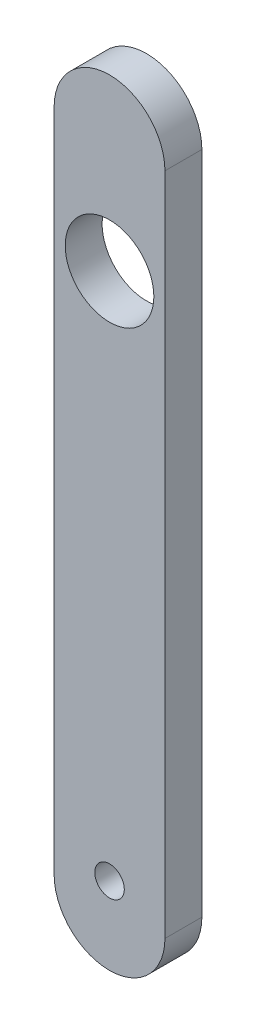
ISO-10303-21;
HEADER;
FILE_DESCRIPTION(('STEP AP214'),'2;1');
FILE_NAME('part.step','',(''),(''),'','','');
FILE_SCHEMA(('AUTOMOTIVE_DESIGN { 1 0 10303 214 1 1 1 1 }'));
ENDSEC;
DATA;
#1=APPLICATION_CONTEXT('core data for automotive mechanical design processes');
#2=APPLICATION_PROTOCOL_DEFINITION('international standard','automotive_design',2000,#1);
#3=PRODUCT_CONTEXT('',#1,'mechanical');
#4=PRODUCT('Part','Part','',(#3));
#5=PRODUCT_RELATED_PRODUCT_CATEGORY('part','',(#4));
#6=PRODUCT_DEFINITION_FORMATION('','',#4);
#7=PRODUCT_DEFINITION_CONTEXT('part definition',#1,'design');
#8=PRODUCT_DEFINITION('design','',#6,#7);
#9=PRODUCT_DEFINITION_SHAPE('','',#8);
#10=(LENGTH_UNIT() NAMED_UNIT(*) SI_UNIT(.MILLI.,.METRE.));
#11=(NAMED_UNIT(*) PLANE_ANGLE_UNIT() SI_UNIT($,.RADIAN.));
#12=(NAMED_UNIT(*) SI_UNIT($,.STERADIAN.) SOLID_ANGLE_UNIT());
#13=UNCERTAINTY_MEASURE_WITH_UNIT(LENGTH_MEASURE(1.E-05),#10,'distance_accuracy_value','');
#14=(GEOMETRIC_REPRESENTATION_CONTEXT(3) GLOBAL_UNCERTAINTY_ASSIGNED_CONTEXT((#13)) GLOBAL_UNIT_ASSIGNED_CONTEXT((#10,
#11,#12)) REPRESENTATION_CONTEXT('',''));
#15=CARTESIAN_POINT('',(0.,0.,0.));
#16=DIRECTION('',(0.,0.,1.));
#17=DIRECTION('',(1.,0.,0.));
#18=AXIS2_PLACEMENT_3D('',#15,#16,#17);
#19=CARTESIAN_POINT('',(7.5,0.,5.));
#20=DIRECTION('',(0.,0.,1.));
#21=DIRECTION('',(1.,0.,0.));
#22=AXIS2_PLACEMENT_3D('',#19,#20,#21);
#23=PLANE('',#22);
#24=CARTESIAN_POINT('',(7.5,3.00000000000001,5.));
#25=DIRECTION('',(0.,0.,1.));
#26=DIRECTION('',(1.,0.,0.));
#27=AXIS2_PLACEMENT_3D('',#24,#25,#26);
#28=CIRCLE('',#27,2.);
#29=CARTESIAN_POINT('',(9.5,3.00000000000001,5.));
#30=VERTEX_POINT('',#29);
#31=EDGE_CURVE('E100',#30,#30,#28,.T.);
#32=ORIENTED_EDGE('',*,*,#31,.F.);
#33=EDGE_LOOP('',(#32));
#34=FACE_BOUND('',#33,.T.);
#35=CARTESIAN_POINT('',(7.5,0.,5.));
#36=DIRECTION('',(0.,0.,1.));
#37=DIRECTION('',(1.,0.,0.));
#38=AXIS2_PLACEMENT_3D('',#35,#36,#37);
#39=CIRCLE('',#38,7.5);
#40=CARTESIAN_POINT('',(0.,0.,5.));
#41=VERTEX_POINT('',#40);
#42=CARTESIAN_POINT('',(15.,0.,5.));
#43=VERTEX_POINT('',#42);
#44=EDGE_CURVE('E85',#41,#43,#39,.T.);
#45=ORIENTED_EDGE('',*,*,#44,.T.);
#46=DIRECTION('',(0.,1.,0.));
#47=VECTOR('',#46,1.);
#48=CARTESIAN_POINT('',(15.,0.,5.));
#49=LINE('',#48,#47);
#50=CARTESIAN_POINT('',(15.,90.,5.));
#51=VERTEX_POINT('',#50);
#52=EDGE_CURVE('E80',#43,#51,#49,.T.);
#53=ORIENTED_EDGE('',*,*,#52,.T.);
#54=CARTESIAN_POINT('',(7.5,90.,5.));
#55=DIRECTION('',(0.,0.,1.));
#56=DIRECTION('',(-1.,0.,0.));
#57=AXIS2_PLACEMENT_3D('',#54,#55,#56);
#58=CIRCLE('',#57,7.5);
#59=CARTESIAN_POINT('',(0.,90.,5.));
#60=VERTEX_POINT('',#59);
#61=EDGE_CURVE('E83',#51,#60,#58,.T.);
#62=ORIENTED_EDGE('',*,*,#61,.T.);
#63=DIRECTION('',(0.,-1.,0.));
#64=VECTOR('',#63,1.);
#65=CARTESIAN_POINT('',(0.,0.,5.));
#66=LINE('',#65,#64);
#67=EDGE_CURVE('E50',#60,#41,#66,.T.);
#68=ORIENTED_EDGE('',*,*,#67,.T.);
#69=EDGE_LOOP('',(#45,#53,#62,#68));
#70=FACE_BOUND('',#69,.T.);
#71=CARTESIAN_POINT('',(7.5,74.5,5.));
#72=DIRECTION('',(0.,0.,1.));
#73=DIRECTION('',(1.,0.,0.));
#74=AXIS2_PLACEMENT_3D('',#71,#72,#73);
#75=CIRCLE('',#74,6.00000000000001);
#76=CARTESIAN_POINT('',(13.5,74.5,5.));
#77=VERTEX_POINT('',#76);
#78=EDGE_CURVE('E115',#77,#77,#75,.T.);
#79=ORIENTED_EDGE('',*,*,#78,.F.);
#80=EDGE_LOOP('',(#79));
#81=FACE_BOUND('',#80,.T.);
#82=ADVANCED_FACE('F33',(#34,#70,#81),#23,.T.);
#83=CARTESIAN_POINT('',(7.5,0.,0.));
#84=DIRECTION('',(0.,0.,1.));
#85=DIRECTION('',(1.,0.,0.));
#86=AXIS2_PLACEMENT_3D('',#83,#84,#85);
#87=PLANE('',#86);
#88=CARTESIAN_POINT('',(7.5,3.00000000000001,0.));
#89=DIRECTION('',(0.,0.,1.));
#90=DIRECTION('',(1.,0.,0.));
#91=AXIS2_PLACEMENT_3D('',#88,#89,#90);
#92=CIRCLE('',#91,2.);
#93=CARTESIAN_POINT('',(9.5,3.00000000000001,0.));
#94=VERTEX_POINT('',#93);
#95=EDGE_CURVE('E112',#94,#94,#92,.T.);
#96=ORIENTED_EDGE('',*,*,#95,.T.);
#97=EDGE_LOOP('',(#96));
#98=FACE_BOUND('',#97,.T.);
#99=CARTESIAN_POINT('',(7.5,0.,0.));
#100=DIRECTION('',(0.,0.,1.));
#101=DIRECTION('',(1.,0.,0.));
#102=AXIS2_PLACEMENT_3D('',#99,#100,#101);
#103=CIRCLE('',#102,7.5);
#104=CARTESIAN_POINT('',(0.,0.,0.));
#105=VERTEX_POINT('',#104);
#106=CARTESIAN_POINT('',(15.,0.,0.));
#107=VERTEX_POINT('',#106);
#108=EDGE_CURVE('E97',#105,#107,#103,.T.);
#109=ORIENTED_EDGE('',*,*,#108,.F.);
#110=DIRECTION('',(0.,-1.,0.));
#111=VECTOR('',#110,1.);
#112=CARTESIAN_POINT('',(0.,0.,0.));
#113=LINE('',#112,#111);
#114=CARTESIAN_POINT('',(0.,90.,0.));
#115=VERTEX_POINT('',#114);
#116=EDGE_CURVE('E73',#115,#105,#113,.T.);
#117=ORIENTED_EDGE('',*,*,#116,.F.);
#118=CARTESIAN_POINT('',(7.5,90.,0.));
#119=DIRECTION('',(0.,0.,1.));
#120=DIRECTION('',(-1.,0.,0.));
#121=AXIS2_PLACEMENT_3D('',#118,#119,#120);
#122=CIRCLE('',#121,7.5);
#123=CARTESIAN_POINT('',(15.,90.,0.));
#124=VERTEX_POINT('',#123);
#125=EDGE_CURVE('E67',#124,#115,#122,.T.);
#126=ORIENTED_EDGE('',*,*,#125,.F.);
#127=DIRECTION('',(0.,1.,0.));
#128=VECTOR('',#127,1.);
#129=CARTESIAN_POINT('',(15.,0.,0.));
#130=LINE('',#129,#128);
#131=EDGE_CURVE('E89',#107,#124,#130,.T.);
#132=ORIENTED_EDGE('',*,*,#131,.F.);
#133=EDGE_LOOP('',(#109,#117,#126,#132));
#134=FACE_BOUND('',#133,.T.);
#135=CARTESIAN_POINT('',(7.5,74.5,0.));
#136=DIRECTION('',(0.,0.,1.));
#137=DIRECTION('',(1.,0.,0.));
#138=AXIS2_PLACEMENT_3D('',#135,#136,#137);
#139=CIRCLE('',#138,6.00000000000001);
#140=CARTESIAN_POINT('',(13.5,74.5,0.));
#141=VERTEX_POINT('',#140);
#142=EDGE_CURVE('E118',#141,#141,#139,.T.);
#143=ORIENTED_EDGE('',*,*,#142,.T.);
#144=EDGE_LOOP('',(#143));
#145=FACE_BOUND('',#144,.T.);
#146=ADVANCED_FACE('F108',(#98,#134,#145),#87,.F.);
#147=CARTESIAN_POINT('',(7.5,0.,5.));
#148=DIRECTION('',(0.,0.,-1.));
#149=DIRECTION('',(-1.,0.,0.));
#150=AXIS2_PLACEMENT_3D('',#147,#148,#149);
#151=CYLINDRICAL_SURFACE('',#150,7.5);
#152=ORIENTED_EDGE('',*,*,#108,.T.);
#153=DIRECTION('',(0.,0.,-1.));
#154=VECTOR('',#153,1.);
#155=CARTESIAN_POINT('',(15.,0.,5.));
#156=LINE('',#155,#154);
#157=EDGE_CURVE('E11',#43,#107,#156,.T.);
#158=ORIENTED_EDGE('',*,*,#157,.F.);
#159=ORIENTED_EDGE('',*,*,#44,.F.);
#160=DIRECTION('',(0.,0.,-1.));
#161=VECTOR('',#160,1.);
#162=CARTESIAN_POINT('',(0.,0.,5.));
#163=LINE('',#162,#161);
#164=EDGE_CURVE('E93',#41,#105,#163,.T.);
#165=ORIENTED_EDGE('',*,*,#164,.T.);
#166=EDGE_LOOP('',(#152,#158,#159,#165));
#167=FACE_BOUND('',#166,.T.);
#168=ADVANCED_FACE('F35',(#167),#151,.T.);
#169=CARTESIAN_POINT('',(15.,0.,5.));
#170=DIRECTION('',(-1.,0.,0.));
#171=DIRECTION('',(0.,0.,1.));
#172=AXIS2_PLACEMENT_3D('',#169,#170,#171);
#173=PLANE('',#172);
#174=ORIENTED_EDGE('',*,*,#131,.T.);
#175=DIRECTION('',(0.,0.,-1.));
#176=VECTOR('',#175,1.);
#177=CARTESIAN_POINT('',(15.,90.,5.));
#178=LINE('',#177,#176);
#179=EDGE_CURVE('E42',#51,#124,#178,.T.);
#180=ORIENTED_EDGE('',*,*,#179,.F.);
#181=ORIENTED_EDGE('',*,*,#52,.F.);
#182=ORIENTED_EDGE('',*,*,#157,.T.);
#183=EDGE_LOOP('',(#174,#180,#181,#182));
#184=FACE_BOUND('',#183,.T.);
#185=ADVANCED_FACE('F88',(#184),#173,.F.);
#186=CARTESIAN_POINT('',(7.5,90.,5.));
#187=DIRECTION('',(0.,0.,-1.));
#188=DIRECTION('',(-1.,0.,0.));
#189=AXIS2_PLACEMENT_3D('',#186,#187,#188);
#190=CYLINDRICAL_SURFACE('',#189,7.5);
#191=ORIENTED_EDGE('',*,*,#125,.T.);
#192=DIRECTION('',(0.,0.,-1.));
#193=VECTOR('',#192,1.);
#194=CARTESIAN_POINT('',(0.,90.,5.));
#195=LINE('',#194,#193);
#196=EDGE_CURVE('E90',#60,#115,#195,.T.);
#197=ORIENTED_EDGE('',*,*,#196,.F.);
#198=ORIENTED_EDGE('',*,*,#61,.F.);
#199=ORIENTED_EDGE('',*,*,#179,.T.);
#200=EDGE_LOOP('',(#191,#197,#198,#199));
#201=FACE_BOUND('',#200,.T.);
#202=ADVANCED_FACE('F91',(#201),#190,.T.);
#203=CARTESIAN_POINT('',(0.,0.,5.));
#204=DIRECTION('',(1.,0.,0.));
#205=DIRECTION('',(0.,0.,-1.));
#206=AXIS2_PLACEMENT_3D('',#203,#204,#205);
#207=PLANE('',#206);
#208=ORIENTED_EDGE('',*,*,#116,.T.);
#209=ORIENTED_EDGE('',*,*,#164,.F.);
#210=ORIENTED_EDGE('',*,*,#67,.F.);
#211=ORIENTED_EDGE('',*,*,#196,.T.);
#212=EDGE_LOOP('',(#208,#209,#210,#211));
#213=FACE_BOUND('',#212,.T.);
#214=ADVANCED_FACE('F105',(#213),#207,.F.);
#215=CARTESIAN_POINT('',(7.5,3.00000000000001,5.));
#216=DIRECTION('',(0.,0.,-1.));
#217=DIRECTION('',(-1.,0.,0.));
#218=AXIS2_PLACEMENT_3D('',#215,#216,#217);
#219=CYLINDRICAL_SURFACE('',#218,2.);
#220=ORIENTED_EDGE('',*,*,#31,.T.);
#221=EDGE_LOOP('',(#220));
#222=FACE_BOUND('',#221,.T.);
#223=ORIENTED_EDGE('',*,*,#95,.F.);
#224=EDGE_LOOP('',(#223));
#225=FACE_BOUND('',#224,.T.);
#226=ADVANCED_FACE('F136',(#222,#225),#219,.F.);
#227=CARTESIAN_POINT('',(7.5,74.5,5.));
#228=DIRECTION('',(0.,0.,-1.));
#229=DIRECTION('',(-1.,0.,0.));
#230=AXIS2_PLACEMENT_3D('',#227,#228,#229);
#231=CYLINDRICAL_SURFACE('',#230,6.00000000000001);
#232=ORIENTED_EDGE('',*,*,#78,.T.);
#233=EDGE_LOOP('',(#232));
#234=FACE_BOUND('',#233,.T.);
#235=ORIENTED_EDGE('',*,*,#142,.F.);
#236=EDGE_LOOP('',(#235));
#237=FACE_BOUND('',#236,.T.);
#238=ADVANCED_FACE('F124',(#234,#237),#231,.F.);
#239=CLOSED_SHELL('',(#82,#146,#168,#185,#202,#214,#226,#238));
#240=MANIFOLD_SOLID_BREP('B2',#239);
#241=ADVANCED_BREP_SHAPE_REPRESENTATION('',(#18,#240),#14);
#242=SHAPE_DEFINITION_REPRESENTATION(#9,#241);
ENDSEC;
END-ISO-10303-21;
